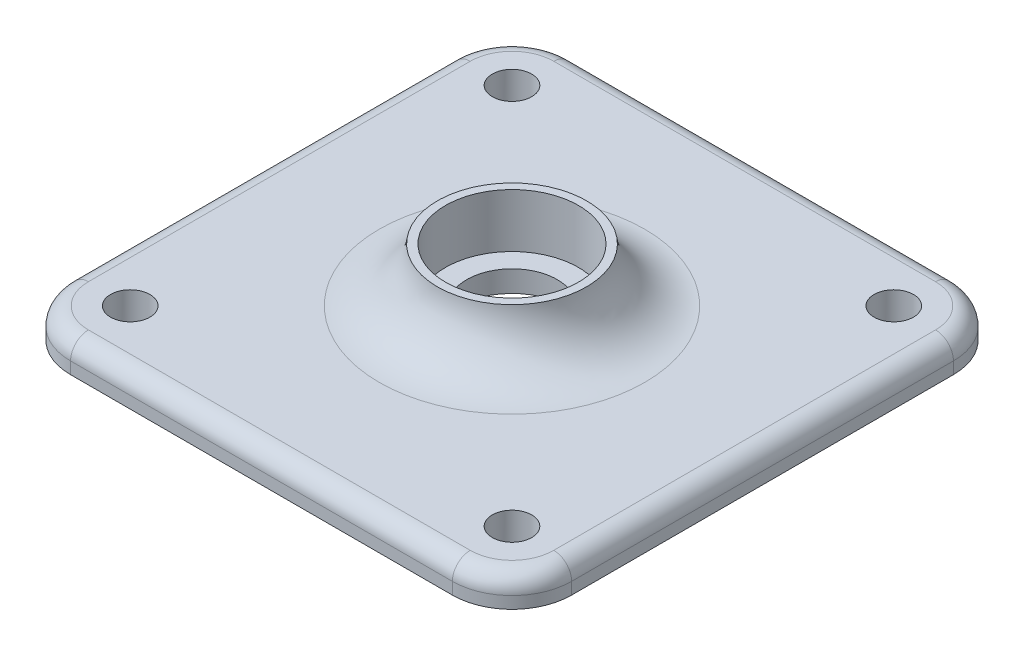
ISO-10303-21;
HEADER;
FILE_DESCRIPTION(('STEP AP214'),'2;1');
FILE_NAME('part.step','',(''),(''),'','','');
FILE_SCHEMA(('AUTOMOTIVE_DESIGN { 1 0 10303 214 1 1 1 1 }'));
ENDSEC;
DATA;
#1=APPLICATION_CONTEXT('core data for automotive mechanical design processes');
#2=APPLICATION_PROTOCOL_DEFINITION('international standard','automotive_design',2000,#1);
#3=PRODUCT_CONTEXT('',#1,'mechanical');
#4=PRODUCT('Part','Part','',(#3));
#5=PRODUCT_RELATED_PRODUCT_CATEGORY('part','',(#4));
#6=PRODUCT_DEFINITION_FORMATION('','',#4);
#7=PRODUCT_DEFINITION_CONTEXT('part definition',#1,'design');
#8=PRODUCT_DEFINITION('design','',#6,#7);
#9=PRODUCT_DEFINITION_SHAPE('','',#8);
#10=(LENGTH_UNIT() NAMED_UNIT(*) SI_UNIT(.MILLI.,.METRE.));
#11=(NAMED_UNIT(*) PLANE_ANGLE_UNIT() SI_UNIT($,.RADIAN.));
#12=(NAMED_UNIT(*) SI_UNIT($,.STERADIAN.) SOLID_ANGLE_UNIT());
#13=UNCERTAINTY_MEASURE_WITH_UNIT(LENGTH_MEASURE(1.E-05),#10,'distance_accuracy_value','');
#14=(GEOMETRIC_REPRESENTATION_CONTEXT(3) GLOBAL_UNCERTAINTY_ASSIGNED_CONTEXT((#13)) GLOBAL_UNIT_ASSIGNED_CONTEXT((#10,
#11,#12)) REPRESENTATION_CONTEXT('',''));
#15=CARTESIAN_POINT('',(0.,0.,0.));
#16=DIRECTION('',(0.,0.,1.));
#17=DIRECTION('',(1.,0.,0.));
#18=AXIS2_PLACEMENT_3D('',#15,#16,#17);
#19=CARTESIAN_POINT('',(32.,5.,-32.));
#20=DIRECTION('',(0.,-1.,0.));
#21=DIRECTION('',(0.,0.,-1.));
#22=AXIS2_PLACEMENT_3D('',#19,#20,#21);
#23=CYLINDRICAL_SURFACE('',#22,10.);
#24=DIRECTION('',(0.,-1.,0.));
#25=VECTOR('',#24,1.);
#26=CARTESIAN_POINT('',(32.,5.,-42.));
#27=LINE('',#26,#25);
#28=CARTESIAN_POINT('',(32.,2.,-42.));
#29=VERTEX_POINT('',#28);
#30=CARTESIAN_POINT('',(32.,0.,-42.));
#31=VERTEX_POINT('',#30);
#32=EDGE_CURVE('E170',#29,#31,#27,.T.);
#33=ORIENTED_EDGE('',*,*,#32,.F.);
#34=CARTESIAN_POINT('',(32.,2.,-32.));
#35=DIRECTION('',(0.,-1.,0.));
#36=DIRECTION('',(0.,0.,-1.));
#37=AXIS2_PLACEMENT_3D('',#34,#35,#36);
#38=CIRCLE('',#37,10.);
#39=CARTESIAN_POINT('',(42.,2.,-32.));
#40=VERTEX_POINT('',#39);
#41=EDGE_CURVE('E130',#29,#40,#38,.T.);
#42=ORIENTED_EDGE('',*,*,#41,.T.);
#43=DIRECTION('',(0.,-1.,0.));
#44=VECTOR('',#43,1.);
#45=CARTESIAN_POINT('',(42.,5.,-32.));
#46=LINE('',#45,#44);
#47=CARTESIAN_POINT('',(42.,0.,-32.));
#48=VERTEX_POINT('',#47);
#49=EDGE_CURVE('E124',#40,#48,#46,.T.);
#50=ORIENTED_EDGE('',*,*,#49,.T.);
#51=CARTESIAN_POINT('',(32.,0.,-32.));
#52=DIRECTION('',(0.,-1.,0.));
#53=DIRECTION('',(0.,0.,-1.));
#54=AXIS2_PLACEMENT_3D('',#51,#52,#53);
#55=CIRCLE('',#54,10.);
#56=EDGE_CURVE('E128',#31,#48,#55,.T.);
#57=ORIENTED_EDGE('',*,*,#56,.F.);
#58=EDGE_LOOP('',(#33,#42,#50,#57));
#59=FACE_BOUND('',#58,.T.);
#60=ADVANCED_FACE('F35',(#59),#23,.T.);
#61=CARTESIAN_POINT('',(32.,5.,-42.));
#62=DIRECTION('',(0.,0.,1.));
#63=DIRECTION('',(1.,0.,0.));
#64=AXIS2_PLACEMENT_3D('',#61,#62,#63);
#65=PLANE('',#64);
#66=DIRECTION('',(0.,-1.,0.));
#67=VECTOR('',#66,1.);
#68=CARTESIAN_POINT('',(-32.,5.,-42.));
#69=LINE('',#68,#67);
#70=CARTESIAN_POINT('',(-32.,2.,-42.));
#71=VERTEX_POINT('',#70);
#72=CARTESIAN_POINT('',(-32.,0.,-42.));
#73=VERTEX_POINT('',#72);
#74=EDGE_CURVE('E173',#71,#73,#69,.T.);
#75=ORIENTED_EDGE('',*,*,#74,.F.);
#76=DIRECTION('',(-1.,0.,0.));
#77=VECTOR('',#76,1.);
#78=CARTESIAN_POINT('',(32.,2.,-42.));
#79=LINE('',#78,#77);
#80=EDGE_CURVE('E204',#71,#29,#79,.F.);
#81=ORIENTED_EDGE('',*,*,#80,.T.);
#82=ORIENTED_EDGE('',*,*,#32,.T.);
#83=DIRECTION('',(-1.,0.,0.));
#84=VECTOR('',#83,1.);
#85=CARTESIAN_POINT('',(32.,0.,-42.));
#86=LINE('',#85,#84);
#87=EDGE_CURVE('E135',#31,#73,#86,.T.);
#88=ORIENTED_EDGE('',*,*,#87,.T.);
#89=EDGE_LOOP('',(#75,#81,#82,#88));
#90=FACE_BOUND('',#89,.T.);
#91=ADVANCED_FACE('F284',(#90),#65,.F.);
#92=CARTESIAN_POINT('',(-32.,5.,-32.));
#93=DIRECTION('',(0.,-1.,0.));
#94=DIRECTION('',(0.,0.,-1.));
#95=AXIS2_PLACEMENT_3D('',#92,#93,#94);
#96=CYLINDRICAL_SURFACE('',#95,10.);
#97=DIRECTION('',(0.,-1.,0.));
#98=VECTOR('',#97,1.);
#99=CARTESIAN_POINT('',(-42.,5.,-32.));
#100=LINE('',#99,#98);
#101=CARTESIAN_POINT('',(-42.,2.,-32.));
#102=VERTEX_POINT('',#101);
#103=CARTESIAN_POINT('',(-42.,0.,-32.));
#104=VERTEX_POINT('',#103);
#105=EDGE_CURVE('E175',#102,#104,#100,.T.);
#106=ORIENTED_EDGE('',*,*,#105,.F.);
#107=CARTESIAN_POINT('',(-32.,2.,-32.));
#108=DIRECTION('',(0.,-1.,0.));
#109=DIRECTION('',(0.,0.,-1.));
#110=AXIS2_PLACEMENT_3D('',#107,#108,#109);
#111=CIRCLE('',#110,10.);
#112=EDGE_CURVE('E206',#102,#71,#111,.T.);
#113=ORIENTED_EDGE('',*,*,#112,.T.);
#114=ORIENTED_EDGE('',*,*,#74,.T.);
#115=CARTESIAN_POINT('',(-32.,0.,-32.));
#116=DIRECTION('',(0.,1.,0.));
#117=DIRECTION('',(0.,0.,1.));
#118=AXIS2_PLACEMENT_3D('',#115,#116,#117);
#119=CIRCLE('',#118,10.);
#120=EDGE_CURVE('E166',#73,#104,#119,.T.);
#121=ORIENTED_EDGE('',*,*,#120,.T.);
#122=EDGE_LOOP('',(#106,#113,#114,#121));
#123=FACE_BOUND('',#122,.T.);
#124=ADVANCED_FACE('F289',(#123),#96,.T.);
#125=CARTESIAN_POINT('',(-42.,5.,-32.));
#126=DIRECTION('',(1.,0.,0.));
#127=DIRECTION('',(0.,0.,-1.));
#128=AXIS2_PLACEMENT_3D('',#125,#126,#127);
#129=PLANE('',#128);
#130=DIRECTION('',(0.,-1.,0.));
#131=VECTOR('',#130,1.);
#132=CARTESIAN_POINT('',(-42.,5.,32.));
#133=LINE('',#132,#131);
#134=CARTESIAN_POINT('',(-42.,2.,32.));
#135=VERTEX_POINT('',#134);
#136=CARTESIAN_POINT('',(-42.,0.,32.));
#137=VERTEX_POINT('',#136);
#138=EDGE_CURVE('E177',#135,#137,#133,.T.);
#139=ORIENTED_EDGE('',*,*,#138,.F.);
#140=DIRECTION('',(0.,0.,1.));
#141=VECTOR('',#140,1.);
#142=CARTESIAN_POINT('',(-42.,2.,-32.));
#143=LINE('',#142,#141);
#144=EDGE_CURVE('E208',#135,#102,#143,.F.);
#145=ORIENTED_EDGE('',*,*,#144,.T.);
#146=ORIENTED_EDGE('',*,*,#105,.T.);
#147=DIRECTION('',(0.,0.,1.));
#148=VECTOR('',#147,1.);
#149=CARTESIAN_POINT('',(-42.,0.,-32.));
#150=LINE('',#149,#148);
#151=EDGE_CURVE('E163',#104,#137,#150,.T.);
#152=ORIENTED_EDGE('',*,*,#151,.T.);
#153=EDGE_LOOP('',(#139,#145,#146,#152));
#154=FACE_BOUND('',#153,.T.);
#155=ADVANCED_FACE('F349',(#154),#129,.F.);
#156=CARTESIAN_POINT('',(-32.,5.,32.));
#157=DIRECTION('',(0.,-1.,0.));
#158=DIRECTION('',(0.,0.,-1.));
#159=AXIS2_PLACEMENT_3D('',#156,#157,#158);
#160=CYLINDRICAL_SURFACE('',#159,10.);
#161=DIRECTION('',(0.,-1.,0.));
#162=VECTOR('',#161,1.);
#163=CARTESIAN_POINT('',(-32.,5.,42.));
#164=LINE('',#163,#162);
#165=CARTESIAN_POINT('',(-32.,2.,42.));
#166=VERTEX_POINT('',#165);
#167=CARTESIAN_POINT('',(-32.,0.,42.));
#168=VERTEX_POINT('',#167);
#169=EDGE_CURVE('E179',#166,#168,#164,.T.);
#170=ORIENTED_EDGE('',*,*,#169,.F.);
#171=CARTESIAN_POINT('',(-32.,2.,32.));
#172=DIRECTION('',(0.,-1.,0.));
#173=DIRECTION('',(0.,0.,-1.));
#174=AXIS2_PLACEMENT_3D('',#171,#172,#173);
#175=CIRCLE('',#174,10.);
#176=EDGE_CURVE('E210',#166,#135,#175,.T.);
#177=ORIENTED_EDGE('',*,*,#176,.T.);
#178=ORIENTED_EDGE('',*,*,#138,.T.);
#179=CARTESIAN_POINT('',(-32.,0.,32.));
#180=DIRECTION('',(0.,-1.,0.));
#181=DIRECTION('',(0.,0.,-1.));
#182=AXIS2_PLACEMENT_3D('',#179,#180,#181);
#183=CIRCLE('',#182,10.);
#184=EDGE_CURVE('E160',#168,#137,#183,.T.);
#185=ORIENTED_EDGE('',*,*,#184,.F.);
#186=EDGE_LOOP('',(#170,#177,#178,#185));
#187=FACE_BOUND('',#186,.T.);
#188=ADVANCED_FACE('F352',(#187),#160,.T.);
#189=CARTESIAN_POINT('',(32.,5.,42.));
#190=DIRECTION('',(0.,0.,1.));
#191=DIRECTION('',(1.,0.,0.));
#192=AXIS2_PLACEMENT_3D('',#189,#190,#191);
#193=PLANE('',#192);
#194=DIRECTION('',(0.,-1.,0.));
#195=VECTOR('',#194,1.);
#196=CARTESIAN_POINT('',(32.,5.,42.));
#197=LINE('',#196,#195);
#198=CARTESIAN_POINT('',(32.,2.,42.));
#199=VERTEX_POINT('',#198);
#200=CARTESIAN_POINT('',(32.,0.,42.));
#201=VERTEX_POINT('',#200);
#202=EDGE_CURVE('E181',#199,#201,#197,.T.);
#203=ORIENTED_EDGE('',*,*,#202,.F.);
#204=DIRECTION('',(-1.,0.,0.));
#205=VECTOR('',#204,1.);
#206=CARTESIAN_POINT('',(-32.,2.,42.));
#207=LINE('',#206,#205);
#208=EDGE_CURVE('E44',#199,#166,#207,.T.);
#209=ORIENTED_EDGE('',*,*,#208,.T.);
#210=ORIENTED_EDGE('',*,*,#169,.T.);
#211=DIRECTION('',(-1.,0.,0.));
#212=VECTOR('',#211,1.);
#213=CARTESIAN_POINT('',(32.,0.,42.));
#214=LINE('',#213,#212);
#215=EDGE_CURVE('E157',#201,#168,#214,.T.);
#216=ORIENTED_EDGE('',*,*,#215,.F.);
#217=EDGE_LOOP('',(#203,#209,#210,#216));
#218=FACE_BOUND('',#217,.T.);
#219=ADVANCED_FACE('F359',(#218),#193,.T.);
#220=CARTESIAN_POINT('',(32.,5.,32.));
#221=DIRECTION('',(0.,-1.,0.));
#222=DIRECTION('',(0.,0.,-1.));
#223=AXIS2_PLACEMENT_3D('',#220,#221,#222);
#224=CYLINDRICAL_SURFACE('',#223,9.99999999999999);
#225=DIRECTION('',(0.,-1.,0.));
#226=VECTOR('',#225,1.);
#227=CARTESIAN_POINT('',(42.,5.,32.));
#228=LINE('',#227,#226);
#229=CARTESIAN_POINT('',(42.,2.,32.));
#230=VERTEX_POINT('',#229);
#231=CARTESIAN_POINT('',(42.,0.,32.));
#232=VERTEX_POINT('',#231);
#233=EDGE_CURVE('E134',#230,#232,#228,.T.);
#234=ORIENTED_EDGE('',*,*,#233,.F.);
#235=CARTESIAN_POINT('',(32.,2.,32.));
#236=DIRECTION('',(0.,-1.,0.));
#237=DIRECTION('',(0.,0.,-1.));
#238=AXIS2_PLACEMENT_3D('',#235,#236,#237);
#239=CIRCLE('',#238,9.99999999999999);
#240=EDGE_CURVE('E11',#230,#199,#239,.T.);
#241=ORIENTED_EDGE('',*,*,#240,.T.);
#242=ORIENTED_EDGE('',*,*,#202,.T.);
#243=CARTESIAN_POINT('',(32.,0.,32.));
#244=DIRECTION('',(0.,-1.,0.));
#245=DIRECTION('',(0.,0.,-1.));
#246=AXIS2_PLACEMENT_3D('',#243,#244,#245);
#247=CIRCLE('',#246,9.99999999999999);
#248=EDGE_CURVE('E143',#232,#201,#247,.T.);
#249=ORIENTED_EDGE('',*,*,#248,.F.);
#250=EDGE_LOOP('',(#234,#241,#242,#249));
#251=FACE_BOUND('',#250,.T.);
#252=ADVANCED_FACE('F274',(#251),#224,.T.);
#253=CARTESIAN_POINT('',(42.,5.,-32.));
#254=DIRECTION('',(1.,0.,0.));
#255=DIRECTION('',(0.,0.,-1.));
#256=AXIS2_PLACEMENT_3D('',#253,#254,#255);
#257=PLANE('',#256);
#258=ORIENTED_EDGE('',*,*,#49,.F.);
#259=DIRECTION('',(0.,0.,1.));
#260=VECTOR('',#259,1.);
#261=CARTESIAN_POINT('',(42.,2.,32.));
#262=LINE('',#261,#260);
#263=EDGE_CURVE('E184',#40,#230,#262,.T.);
#264=ORIENTED_EDGE('',*,*,#263,.T.);
#265=ORIENTED_EDGE('',*,*,#233,.T.);
#266=DIRECTION('',(0.,0.,1.));
#267=VECTOR('',#266,1.);
#268=CARTESIAN_POINT('',(42.,0.,-32.));
#269=LINE('',#268,#267);
#270=EDGE_CURVE('E138',#48,#232,#269,.T.);
#271=ORIENTED_EDGE('',*,*,#270,.F.);
#272=EDGE_LOOP('',(#258,#264,#265,#271));
#273=FACE_BOUND('',#272,.T.);
#274=ADVANCED_FACE('F139',(#273),#257,.T.);
#275=CARTESIAN_POINT('',(32.,5.,-32.));
#276=DIRECTION('',(0.,-1.,0.));
#277=DIRECTION('',(0.,0.,-1.));
#278=AXIS2_PLACEMENT_3D('',#275,#276,#277);
#279=PLANE('',#278);
#280=CARTESIAN_POINT('',(-32.,5.,-32.));
#281=DIRECTION('',(0.,1.,0.));
#282=DIRECTION('',(0.,0.,1.));
#283=AXIS2_PLACEMENT_3D('',#280,#281,#282);
#284=CIRCLE('',#283,3.3);
#285=CARTESIAN_POINT('',(-32.,5.,-28.7));
#286=VERTEX_POINT('',#285);
#287=EDGE_CURVE('E567',#286,#286,#284,.T.);
#288=ORIENTED_EDGE('',*,*,#287,.F.);
#289=EDGE_LOOP('',(#288));
#290=FACE_BOUND('',#289,.T.);
#291=CARTESIAN_POINT('',(-32.,5.,32.));
#292=DIRECTION('',(0.,1.,0.));
#293=DIRECTION('',(0.,0.,1.));
#294=AXIS2_PLACEMENT_3D('',#291,#292,#293);
#295=CIRCLE('',#294,3.3);
#296=CARTESIAN_POINT('',(-32.,5.,35.3));
#297=VERTEX_POINT('',#296);
#298=EDGE_CURVE('E569',#297,#297,#295,.T.);
#299=ORIENTED_EDGE('',*,*,#298,.F.);
#300=EDGE_LOOP('',(#299));
#301=FACE_BOUND('',#300,.T.);
#302=CARTESIAN_POINT('',(32.,5.,32.));
#303=DIRECTION('',(0.,1.,0.));
#304=DIRECTION('',(0.,0.,1.));
#305=AXIS2_PLACEMENT_3D('',#302,#303,#304);
#306=CIRCLE('',#305,3.3);
#307=CARTESIAN_POINT('',(32.,5.,35.3));
#308=VERTEX_POINT('',#307);
#309=EDGE_CURVE('E574',#308,#308,#306,.T.);
#310=ORIENTED_EDGE('',*,*,#309,.F.);
#311=EDGE_LOOP('',(#310));
#312=FACE_BOUND('',#311,.T.);
#313=CARTESIAN_POINT('',(32.,5.,-32.));
#314=DIRECTION('',(0.,1.,0.));
#315=DIRECTION('',(0.,0.,1.));
#316=AXIS2_PLACEMENT_3D('',#313,#314,#315);
#317=CIRCLE('',#316,3.3);
#318=CARTESIAN_POINT('',(32.,5.,-28.7));
#319=VERTEX_POINT('',#318);
#320=EDGE_CURVE('E579',#319,#319,#317,.T.);
#321=ORIENTED_EDGE('',*,*,#320,.F.);
#322=EDGE_LOOP('',(#321));
#323=FACE_BOUND('',#322,.T.);
#324=CARTESIAN_POINT('',(32.,5.,32.));
#325=DIRECTION('',(0.,-1.,0.));
#326=DIRECTION('',(0.,0.,-1.));
#327=AXIS2_PLACEMENT_3D('',#324,#325,#326);
#328=CIRCLE('',#327,6.99999999999999);
#329=CARTESIAN_POINT('',(32.,5.,39.));
#330=VERTEX_POINT('',#329);
#331=CARTESIAN_POINT('',(39.,5.,32.));
#332=VERTEX_POINT('',#331);
#333=EDGE_CURVE('E186',#330,#332,#328,.F.);
#334=ORIENTED_EDGE('',*,*,#333,.T.);
#335=DIRECTION('',(0.,0.,1.));
#336=VECTOR('',#335,1.);
#337=CARTESIAN_POINT('',(39.,5.,-32.));
#338=LINE('',#337,#336);
#339=CARTESIAN_POINT('',(39.,5.,-32.));
#340=VERTEX_POINT('',#339);
#341=EDGE_CURVE('E200',#332,#340,#338,.F.);
#342=ORIENTED_EDGE('',*,*,#341,.T.);
#343=CARTESIAN_POINT('',(32.,5.,-32.));
#344=DIRECTION('',(0.,-1.,0.));
#345=DIRECTION('',(0.,0.,-1.));
#346=AXIS2_PLACEMENT_3D('',#343,#344,#345);
#347=CIRCLE('',#346,7.);
#348=CARTESIAN_POINT('',(32.,5.,-39.));
#349=VERTEX_POINT('',#348);
#350=EDGE_CURVE('E198',#340,#349,#347,.F.);
#351=ORIENTED_EDGE('',*,*,#350,.T.);
#352=DIRECTION('',(-1.,0.,0.));
#353=VECTOR('',#352,1.);
#354=CARTESIAN_POINT('',(32.,5.,-39.));
#355=LINE('',#354,#353);
#356=CARTESIAN_POINT('',(-32.,5.,-39.));
#357=VERTEX_POINT('',#356);
#358=EDGE_CURVE('E196',#349,#357,#355,.T.);
#359=ORIENTED_EDGE('',*,*,#358,.T.);
#360=CARTESIAN_POINT('',(-32.,5.,-32.));
#361=DIRECTION('',(0.,-1.,0.));
#362=DIRECTION('',(0.,0.,-1.));
#363=AXIS2_PLACEMENT_3D('',#360,#361,#362);
#364=CIRCLE('',#363,7.);
#365=CARTESIAN_POINT('',(-39.,5.,-32.));
#366=VERTEX_POINT('',#365);
#367=EDGE_CURVE('E194',#357,#366,#364,.F.);
#368=ORIENTED_EDGE('',*,*,#367,.T.);
#369=DIRECTION('',(0.,0.,1.));
#370=VECTOR('',#369,1.);
#371=CARTESIAN_POINT('',(-39.,5.,-32.));
#372=LINE('',#371,#370);
#373=CARTESIAN_POINT('',(-39.,5.,32.));
#374=VERTEX_POINT('',#373);
#375=EDGE_CURVE('E192',#366,#374,#372,.T.);
#376=ORIENTED_EDGE('',*,*,#375,.T.);
#377=CARTESIAN_POINT('',(-32.,5.,32.));
#378=DIRECTION('',(0.,-1.,0.));
#379=DIRECTION('',(0.,0.,-1.));
#380=AXIS2_PLACEMENT_3D('',#377,#378,#379);
#381=CIRCLE('',#380,7.);
#382=CARTESIAN_POINT('',(-32.,5.,39.));
#383=VERTEX_POINT('',#382);
#384=EDGE_CURVE('E190',#374,#383,#381,.F.);
#385=ORIENTED_EDGE('',*,*,#384,.T.);
#386=DIRECTION('',(-1.,0.,0.));
#387=VECTOR('',#386,1.);
#388=CARTESIAN_POINT('',(32.,5.,39.));
#389=LINE('',#388,#387);
#390=EDGE_CURVE('E188',#383,#330,#389,.F.);
#391=ORIENTED_EDGE('',*,*,#390,.T.);
#392=EDGE_LOOP('',(#334,#342,#351,#359,#368,#376,#385,#391));
#393=FACE_BOUND('',#392,.T.);
#394=CARTESIAN_POINT('',(0.,5.,0.));
#395=DIRECTION('',(0.,1.,0.));
#396=DIRECTION('',(0.,0.,1.));
#397=AXIS2_PLACEMENT_3D('',#394,#395,#396);
#398=CIRCLE('',#397,22.25);
#399=CARTESIAN_POINT('',(0.,5.,22.25));
#400=VERTEX_POINT('',#399);
#401=EDGE_CURVE('E172',#400,#400,#398,.T.);
#402=ORIENTED_EDGE('',*,*,#401,.F.);
#403=EDGE_LOOP('',(#402));
#404=FACE_BOUND('',#403,.T.);
#405=ADVANCED_FACE('F262',(#290,#301,#312,#323,#393,#404),#279,.F.);
#406=CARTESIAN_POINT('',(32.,0.,-32.));
#407=DIRECTION('',(0.,-1.,0.));
#408=DIRECTION('',(0.,0.,-1.));
#409=AXIS2_PLACEMENT_3D('',#406,#407,#408);
#410=PLANE('',#409);
#411=CARTESIAN_POINT('',(-32.,0.,-32.));
#412=DIRECTION('',(0.,-1.,0.));
#413=DIRECTION('',(0.,0.,-1.));
#414=AXIS2_PLACEMENT_3D('',#411,#412,#413);
#415=CIRCLE('',#414,3.3);
#416=CARTESIAN_POINT('',(-32.,0.,-35.3));
#417=VERTEX_POINT('',#416);
#418=EDGE_CURVE('E565',#417,#417,#415,.T.);
#419=ORIENTED_EDGE('',*,*,#418,.F.);
#420=EDGE_LOOP('',(#419));
#421=FACE_BOUND('',#420,.T.);
#422=CARTESIAN_POINT('',(-32.,0.,32.));
#423=DIRECTION('',(0.,-1.,0.));
#424=DIRECTION('',(0.,0.,-1.));
#425=AXIS2_PLACEMENT_3D('',#422,#423,#424);
#426=CIRCLE('',#425,3.3);
#427=CARTESIAN_POINT('',(-32.,0.,28.7));
#428=VERTEX_POINT('',#427);
#429=EDGE_CURVE('E39',#428,#428,#426,.T.);
#430=ORIENTED_EDGE('',*,*,#429,.F.);
#431=EDGE_LOOP('',(#430));
#432=FACE_BOUND('',#431,.T.);
#433=CARTESIAN_POINT('',(32.,0.,32.));
#434=DIRECTION('',(0.,-1.,0.));
#435=DIRECTION('',(0.,0.,-1.));
#436=AXIS2_PLACEMENT_3D('',#433,#434,#435);
#437=CIRCLE('',#436,3.3);
#438=CARTESIAN_POINT('',(32.,0.,28.7));
#439=VERTEX_POINT('',#438);
#440=EDGE_CURVE('E577',#439,#439,#437,.T.);
#441=ORIENTED_EDGE('',*,*,#440,.F.);
#442=EDGE_LOOP('',(#441));
#443=FACE_BOUND('',#442,.T.);
#444=CARTESIAN_POINT('',(32.,0.,-32.));
#445=DIRECTION('',(0.,-1.,0.));
#446=DIRECTION('',(0.,0.,-1.));
#447=AXIS2_PLACEMENT_3D('',#444,#445,#446);
#448=CIRCLE('',#447,3.3);
#449=CARTESIAN_POINT('',(32.,0.,-35.3));
#450=VERTEX_POINT('',#449);
#451=EDGE_CURVE('E216',#450,#450,#448,.T.);
#452=ORIENTED_EDGE('',*,*,#451,.F.);
#453=EDGE_LOOP('',(#452));
#454=FACE_BOUND('',#453,.T.);
#455=CARTESIAN_POINT('',(0.,0.,0.));
#456=DIRECTION('',(0.,1.,0.));
#457=DIRECTION('',(0.,0.,1.));
#458=AXIS2_PLACEMENT_3D('',#455,#456,#457);
#459=CIRCLE('',#458,9.6);
#460=CARTESIAN_POINT('',(0.,0.,9.6));
#461=VERTEX_POINT('',#460);
#462=EDGE_CURVE('E240',#461,#461,#459,.T.);
#463=ORIENTED_EDGE('',*,*,#462,.T.);
#464=EDGE_LOOP('',(#463));
#465=FACE_BOUND('',#464,.T.);
#466=ORIENTED_EDGE('',*,*,#56,.T.);
#467=ORIENTED_EDGE('',*,*,#270,.T.);
#468=ORIENTED_EDGE('',*,*,#248,.T.);
#469=ORIENTED_EDGE('',*,*,#215,.T.);
#470=ORIENTED_EDGE('',*,*,#184,.T.);
#471=ORIENTED_EDGE('',*,*,#151,.F.);
#472=ORIENTED_EDGE('',*,*,#120,.F.);
#473=ORIENTED_EDGE('',*,*,#87,.F.);
#474=EDGE_LOOP('',(#466,#467,#468,#469,#470,#471,#472,#473));
#475=FACE_BOUND('',#474,.T.);
#476=ADVANCED_FACE('F146',(#421,#432,#443,#454,#465,#475),#410,.T.);
#477=CARTESIAN_POINT('',(0.,14.,0.));
#478=DIRECTION('',(0.,-1.,0.));
#479=DIRECTION('',(0.,0.,-1.));
#480=AXIS2_PLACEMENT_3D('',#477,#478,#479);
#481=PLANE('',#480);
#482=CARTESIAN_POINT('',(0.,14.,0.));
#483=DIRECTION('',(0.,1.,0.));
#484=DIRECTION('',(0.,0.,1.));
#485=AXIS2_PLACEMENT_3D('',#482,#483,#484);
#486=CIRCLE('',#485,11.15);
#487=CARTESIAN_POINT('',(0.,14.,11.15));
#488=VERTEX_POINT('',#487);
#489=EDGE_CURVE('E252',#488,#488,#486,.T.);
#490=ORIENTED_EDGE('',*,*,#489,.F.);
#491=EDGE_LOOP('',(#490));
#492=FACE_BOUND('',#491,.T.);
#493=CARTESIAN_POINT('',(0.,14.,0.));
#494=DIRECTION('',(0.,1.,0.));
#495=DIRECTION('',(0.,0.,1.));
#496=AXIS2_PLACEMENT_3D('',#493,#494,#495);
#497=CIRCLE('',#496,12.5);
#498=CARTESIAN_POINT('',(0.,14.,12.5));
#499=VERTEX_POINT('',#498);
#500=EDGE_CURVE('E149',#499,#499,#497,.T.);
#501=ORIENTED_EDGE('',*,*,#500,.T.);
#502=EDGE_LOOP('',(#501));
#503=FACE_BOUND('',#502,.T.);
#504=ADVANCED_FACE('F271',(#492,#503),#481,.F.);
#505=CARTESIAN_POINT('',(0.,14.9979982924372,0.));
#506=DIRECTION('',(0.,1.,0.));
#507=DIRECTION('',(0.,0.,1.));
#508=AXIS2_PLACEMENT_3D('',#505,#506,#507);
#509=TOROIDAL_SURFACE('',#508,22.4500753468651,10.);
#510=ORIENTED_EDGE('',*,*,#401,.T.);
#511=EDGE_LOOP('',(#510));
#512=FACE_BOUND('',#511,.T.);
#513=ORIENTED_EDGE('',*,*,#500,.F.);
#514=EDGE_LOOP('',(#513));
#515=FACE_BOUND('',#514,.T.);
#516=ADVANCED_FACE('F259',(#512,#515),#509,.F.);
#517=CARTESIAN_POINT('',(0.,0.,0.));
#518=DIRECTION('',(0.,1.,0.));
#519=DIRECTION('',(0.,0.,1.));
#520=AXIS2_PLACEMENT_3D('',#517,#518,#519);
#521=CYLINDRICAL_SURFACE('',#520,11.15);
#522=CARTESIAN_POINT('',(0.,5.00000000000001,0.));
#523=DIRECTION('',(0.,1.,0.));
#524=DIRECTION('',(0.,0.,1.));
#525=AXIS2_PLACEMENT_3D('',#522,#523,#524);
#526=CIRCLE('',#525,11.15);
#527=CARTESIAN_POINT('',(0.,5.00000000000001,11.15));
#528=VERTEX_POINT('',#527);
#529=EDGE_CURVE('E152',#528,#528,#526,.T.);
#530=ORIENTED_EDGE('',*,*,#529,.F.);
#531=EDGE_LOOP('',(#530));
#532=FACE_BOUND('',#531,.T.);
#533=ORIENTED_EDGE('',*,*,#489,.T.);
#534=EDGE_LOOP('',(#533));
#535=FACE_BOUND('',#534,.T.);
#536=ADVANCED_FACE('F281',(#532,#535),#521,.F.);
#537=CARTESIAN_POINT('',(0.,5.,0.));
#538=DIRECTION('',(0.,1.,0.));
#539=DIRECTION('',(0.,0.,1.));
#540=AXIS2_PLACEMENT_3D('',#537,#538,#539);
#541=CIRCLE('',#540,7.6);
#542=CARTESIAN_POINT('',(0.,5.,7.6));
#543=VERTEX_POINT('',#542);
#544=EDGE_CURVE('E234',#543,#543,#541,.T.);
#545=ORIENTED_EDGE('',*,*,#544,.F.);
#546=EDGE_LOOP('',(#545));
#547=FACE_BOUND('',#546,.T.);
#548=ORIENTED_EDGE('',*,*,#529,.T.);
#549=EDGE_LOOP('',(#548));
#550=FACE_BOUND('',#549,.T.);
#551=ADVANCED_FACE('F266',(#547,#550),#279,.F.);
#552=CARTESIAN_POINT('',(0.,2.00869631555949,0.));
#553=DIRECTION('',(0.,1.,0.));
#554=DIRECTION('',(0.,0.,1.));
#555=AXIS2_PLACEMENT_3D('',#552,#553,#554);
#556=TOROIDAL_SURFACE('',#555,7.37174078889871,3.);
#557=ORIENTED_EDGE('',*,*,#544,.T.);
#558=EDGE_LOOP('',(#557));
#559=FACE_BOUND('',#558,.T.);
#560=CARTESIAN_POINT('',(0.,4.01739263111897,0.));
#561=DIRECTION('',(0.,1.,0.));
#562=DIRECTION('',(0.,0.,1.));
#563=AXIS2_PLACEMENT_3D('',#560,#561,#562);
#564=CIRCLE('',#563,9.6);
#565=CARTESIAN_POINT('',(0.,4.01739263111897,9.6));
#566=VERTEX_POINT('',#565);
#567=EDGE_CURVE('E245',#566,#566,#564,.T.);
#568=ORIENTED_EDGE('',*,*,#567,.F.);
#569=EDGE_LOOP('',(#568));
#570=FACE_BOUND('',#569,.T.);
#571=ADVANCED_FACE('F280',(#559,#570),#556,.F.);
#572=CARTESIAN_POINT('',(0.,0.,0.));
#573=DIRECTION('',(0.,1.,0.));
#574=DIRECTION('',(0.,0.,1.));
#575=AXIS2_PLACEMENT_3D('',#572,#573,#574);
#576=CYLINDRICAL_SURFACE('',#575,9.6);
#577=ORIENTED_EDGE('',*,*,#462,.F.);
#578=EDGE_LOOP('',(#577));
#579=FACE_BOUND('',#578,.T.);
#580=ORIENTED_EDGE('',*,*,#567,.T.);
#581=EDGE_LOOP('',(#580));
#582=FACE_BOUND('',#581,.T.);
#583=ADVANCED_FACE('F323',(#579,#582),#576,.F.);
#584=CARTESIAN_POINT('',(-39.,2.,-32.));
#585=DIRECTION('',(0.,0.,1.));
#586=DIRECTION('',(1.,0.,0.));
#587=AXIS2_PLACEMENT_3D('',#584,#585,#586);
#588=CYLINDRICAL_SURFACE('',#587,3.);
#589=CARTESIAN_POINT('',(-39.,2.,32.));
#590=DIRECTION('',(0.,0.,1.));
#591=DIRECTION('',(1.,0.,0.));
#592=AXIS2_PLACEMENT_3D('',#589,#590,#591);
#593=CIRCLE('',#592,3.);
#594=EDGE_CURVE('E230',#374,#135,#593,.T.);
#595=ORIENTED_EDGE('',*,*,#594,.F.);
#596=ORIENTED_EDGE('',*,*,#375,.F.);
#597=CARTESIAN_POINT('',(-39.,2.,-32.));
#598=DIRECTION('',(0.,0.,-1.));
#599=DIRECTION('',(-1.,0.,0.));
#600=AXIS2_PLACEMENT_3D('',#597,#598,#599);
#601=CIRCLE('',#600,3.);
#602=EDGE_CURVE('E232',#102,#366,#601,.T.);
#603=ORIENTED_EDGE('',*,*,#602,.F.);
#604=ORIENTED_EDGE('',*,*,#144,.F.);
#605=EDGE_LOOP('',(#595,#596,#603,#604));
#606=FACE_BOUND('',#605,.T.);
#607=ADVANCED_FACE('F37',(#606),#588,.T.);
#608=CARTESIAN_POINT('',(-32.,2.,-32.));
#609=DIRECTION('',(0.,-1.,0.));
#610=DIRECTION('',(0.,0.,-1.));
#611=AXIS2_PLACEMENT_3D('',#608,#609,#610);
#612=TOROIDAL_SURFACE('',#611,7.,3.);
#613=ORIENTED_EDGE('',*,*,#602,.T.);
#614=ORIENTED_EDGE('',*,*,#367,.F.);
#615=CARTESIAN_POINT('',(-32.,2.,-39.));
#616=DIRECTION('',(1.,0.,0.));
#617=DIRECTION('',(0.,0.,-1.));
#618=AXIS2_PLACEMENT_3D('',#615,#616,#617);
#619=CIRCLE('',#618,3.);
#620=EDGE_CURVE('E227',#71,#357,#619,.T.);
#621=ORIENTED_EDGE('',*,*,#620,.F.);
#622=ORIENTED_EDGE('',*,*,#112,.F.);
#623=EDGE_LOOP('',(#613,#614,#621,#622));
#624=FACE_BOUND('',#623,.T.);
#625=ADVANCED_FACE('F317',(#624),#612,.T.);
#626=CARTESIAN_POINT('',(-32.,2.,32.));
#627=DIRECTION('',(0.,-1.,0.));
#628=DIRECTION('',(0.,0.,-1.));
#629=AXIS2_PLACEMENT_3D('',#626,#627,#628);
#630=TOROIDAL_SURFACE('',#629,7.,3.);
#631=ORIENTED_EDGE('',*,*,#594,.T.);
#632=ORIENTED_EDGE('',*,*,#176,.F.);
#633=CARTESIAN_POINT('',(-32.,2.,39.));
#634=DIRECTION('',(1.,0.,0.));
#635=DIRECTION('',(0.,0.,-1.));
#636=AXIS2_PLACEMENT_3D('',#633,#634,#635);
#637=CIRCLE('',#636,3.);
#638=EDGE_CURVE('E224',#383,#166,#637,.T.);
#639=ORIENTED_EDGE('',*,*,#638,.F.);
#640=ORIENTED_EDGE('',*,*,#384,.F.);
#641=EDGE_LOOP('',(#631,#632,#639,#640));
#642=FACE_BOUND('',#641,.T.);
#643=ADVANCED_FACE('F314',(#642),#630,.T.);
#644=CARTESIAN_POINT('',(32.,2.,-39.));
#645=DIRECTION('',(-1.,0.,0.));
#646=DIRECTION('',(0.,0.,1.));
#647=AXIS2_PLACEMENT_3D('',#644,#645,#646);
#648=CYLINDRICAL_SURFACE('',#647,3.);
#649=ORIENTED_EDGE('',*,*,#620,.T.);
#650=ORIENTED_EDGE('',*,*,#358,.F.);
#651=CARTESIAN_POINT('',(32.,2.,-39.));
#652=DIRECTION('',(1.,0.,0.));
#653=DIRECTION('',(0.,0.,-1.));
#654=AXIS2_PLACEMENT_3D('',#651,#652,#653);
#655=CIRCLE('',#654,3.);
#656=EDGE_CURVE('E221',#29,#349,#655,.T.);
#657=ORIENTED_EDGE('',*,*,#656,.F.);
#658=ORIENTED_EDGE('',*,*,#80,.F.);
#659=EDGE_LOOP('',(#649,#650,#657,#658));
#660=FACE_BOUND('',#659,.T.);
#661=ADVANCED_FACE('F310',(#660),#648,.T.);
#662=CARTESIAN_POINT('',(32.,2.,39.));
#663=DIRECTION('',(1.,0.,0.));
#664=DIRECTION('',(0.,0.,-1.));
#665=AXIS2_PLACEMENT_3D('',#662,#663,#664);
#666=CYLINDRICAL_SURFACE('',#665,3.);
#667=ORIENTED_EDGE('',*,*,#638,.T.);
#668=ORIENTED_EDGE('',*,*,#208,.F.);
#669=CARTESIAN_POINT('',(32.,2.,39.));
#670=DIRECTION('',(1.,0.,0.));
#671=DIRECTION('',(0.,0.,-1.));
#672=AXIS2_PLACEMENT_3D('',#669,#670,#671);
#673=CIRCLE('',#672,3.);
#674=EDGE_CURVE('E218',#330,#199,#673,.T.);
#675=ORIENTED_EDGE('',*,*,#674,.F.);
#676=ORIENTED_EDGE('',*,*,#390,.F.);
#677=EDGE_LOOP('',(#667,#668,#675,#676));
#678=FACE_BOUND('',#677,.T.);
#679=ADVANCED_FACE('F306',(#678),#666,.T.);
#680=CARTESIAN_POINT('',(32.,2.,-32.));
#681=DIRECTION('',(0.,-1.,0.));
#682=DIRECTION('',(0.,0.,-1.));
#683=AXIS2_PLACEMENT_3D('',#680,#681,#682);
#684=TOROIDAL_SURFACE('',#683,7.,3.);
#685=ORIENTED_EDGE('',*,*,#656,.T.);
#686=ORIENTED_EDGE('',*,*,#350,.F.);
#687=CARTESIAN_POINT('',(39.,2.,-32.));
#688=DIRECTION('',(0.,0.,1.));
#689=DIRECTION('',(1.,0.,0.));
#690=AXIS2_PLACEMENT_3D('',#687,#688,#689);
#691=CIRCLE('',#690,3.);
#692=EDGE_CURVE('E215',#40,#340,#691,.T.);
#693=ORIENTED_EDGE('',*,*,#692,.F.);
#694=ORIENTED_EDGE('',*,*,#41,.F.);
#695=EDGE_LOOP('',(#685,#686,#693,#694));
#696=FACE_BOUND('',#695,.T.);
#697=ADVANCED_FACE('F302',(#696),#684,.T.);
#698=CARTESIAN_POINT('',(32.,2.,32.));
#699=DIRECTION('',(0.,-1.,0.));
#700=DIRECTION('',(0.,0.,-1.));
#701=AXIS2_PLACEMENT_3D('',#698,#699,#700);
#702=TOROIDAL_SURFACE('',#701,6.99999999999999,3.);
#703=ORIENTED_EDGE('',*,*,#674,.T.);
#704=ORIENTED_EDGE('',*,*,#240,.F.);
#705=CARTESIAN_POINT('',(39.,2.,32.));
#706=DIRECTION('',(0.,0.,-1.));
#707=DIRECTION('',(-1.,0.,0.));
#708=AXIS2_PLACEMENT_3D('',#705,#706,#707);
#709=CIRCLE('',#708,3.);
#710=EDGE_CURVE('E213',#332,#230,#709,.T.);
#711=ORIENTED_EDGE('',*,*,#710,.F.);
#712=ORIENTED_EDGE('',*,*,#333,.F.);
#713=EDGE_LOOP('',(#703,#704,#711,#712));
#714=FACE_BOUND('',#713,.T.);
#715=ADVANCED_FACE('F298',(#714),#702,.T.);
#716=CARTESIAN_POINT('',(39.,2.,-32.));
#717=DIRECTION('',(0.,0.,-1.));
#718=DIRECTION('',(-1.,0.,0.));
#719=AXIS2_PLACEMENT_3D('',#716,#717,#718);
#720=CYLINDRICAL_SURFACE('',#719,3.);
#721=ORIENTED_EDGE('',*,*,#692,.T.);
#722=ORIENTED_EDGE('',*,*,#341,.F.);
#723=ORIENTED_EDGE('',*,*,#710,.T.);
#724=ORIENTED_EDGE('',*,*,#263,.F.);
#725=EDGE_LOOP('',(#721,#722,#723,#724));
#726=FACE_BOUND('',#725,.T.);
#727=ADVANCED_FACE('F294',(#726),#720,.T.);
#728=CARTESIAN_POINT('',(32.,5.,-32.));
#729=DIRECTION('',(0.,1.,0.));
#730=DIRECTION('',(0.,0.,1.));
#731=AXIS2_PLACEMENT_3D('',#728,#729,#730);
#732=CYLINDRICAL_SURFACE('',#731,3.3);
#733=ORIENTED_EDGE('',*,*,#451,.T.);
#734=EDGE_LOOP('',(#733));
#735=FACE_BOUND('',#734,.T.);
#736=ORIENTED_EDGE('',*,*,#320,.T.);
#737=EDGE_LOOP('',(#736));
#738=FACE_BOUND('',#737,.T.);
#739=ADVANCED_FACE('F297',(#735,#738),#732,.F.);
#740=CARTESIAN_POINT('',(32.,5.,32.));
#741=DIRECTION('',(0.,1.,0.));
#742=DIRECTION('',(0.,0.,1.));
#743=AXIS2_PLACEMENT_3D('',#740,#741,#742);
#744=CYLINDRICAL_SURFACE('',#743,3.3);
#745=ORIENTED_EDGE('',*,*,#440,.T.);
#746=EDGE_LOOP('',(#745));
#747=FACE_BOUND('',#746,.T.);
#748=ORIENTED_EDGE('',*,*,#309,.T.);
#749=EDGE_LOOP('',(#748));
#750=FACE_BOUND('',#749,.T.);
#751=ADVANCED_FACE('F465',(#747,#750),#744,.F.);
#752=CARTESIAN_POINT('',(-32.,5.,32.));
#753=DIRECTION('',(0.,1.,0.));
#754=DIRECTION('',(0.,0.,1.));
#755=AXIS2_PLACEMENT_3D('',#752,#753,#754);
#756=CYLINDRICAL_SURFACE('',#755,3.3);
#757=ORIENTED_EDGE('',*,*,#429,.T.);
#758=EDGE_LOOP('',(#757));
#759=FACE_BOUND('',#758,.T.);
#760=ORIENTED_EDGE('',*,*,#298,.T.);
#761=EDGE_LOOP('',(#760));
#762=FACE_BOUND('',#761,.T.);
#763=ADVANCED_FACE('F475',(#759,#762),#756,.F.);
#764=CARTESIAN_POINT('',(-32.,5.,-32.));
#765=DIRECTION('',(0.,1.,0.));
#766=DIRECTION('',(0.,0.,1.));
#767=AXIS2_PLACEMENT_3D('',#764,#765,#766);
#768=CYLINDRICAL_SURFACE('',#767,3.3);
#769=ORIENTED_EDGE('',*,*,#418,.T.);
#770=EDGE_LOOP('',(#769));
#771=FACE_BOUND('',#770,.T.);
#772=ORIENTED_EDGE('',*,*,#287,.T.);
#773=EDGE_LOOP('',(#772));
#774=FACE_BOUND('',#773,.T.);
#775=ADVANCED_FACE('F485',(#771,#774),#768,.F.);
#776=CLOSED_SHELL('',(#60,#91,#124,#155,#188,#219,#252,#274,#405,#476,#504,#516,#536,#551,#571,
#583,#607,#625,#643,#661,#679,#697,#715,#727,#739,#751,#763,#775));
#777=MANIFOLD_SOLID_BREP('B2',#776);
#778=ADVANCED_BREP_SHAPE_REPRESENTATION('',(#18,#777),#14);
#779=SHAPE_DEFINITION_REPRESENTATION(#9,#778);
ENDSEC;
END-ISO-10303-21;
